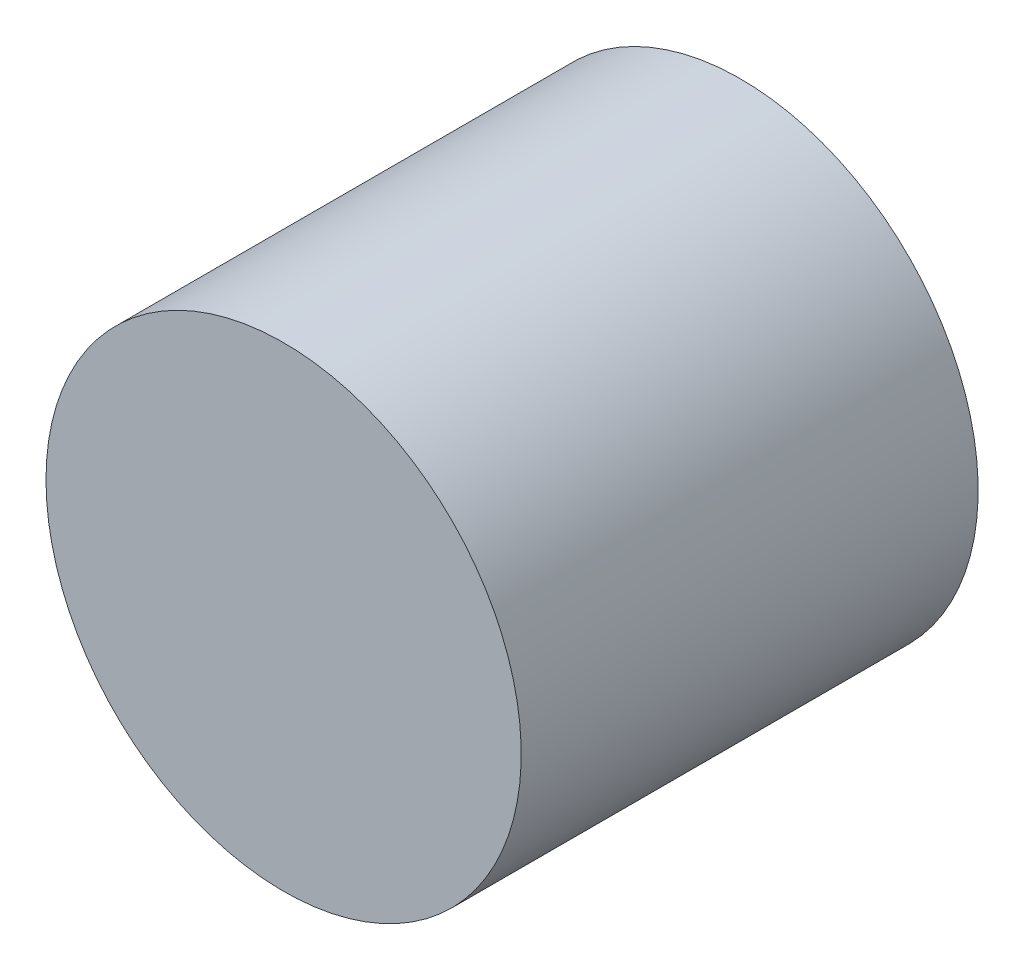
ISO-10303-21;
HEADER;
FILE_DESCRIPTION(('STEP AP214'),'2;1');
FILE_NAME('part.step','',(''),(''),'','','');
FILE_SCHEMA(('AUTOMOTIVE_DESIGN { 1 0 10303 214 1 1 1 1 }'));
ENDSEC;
DATA;
#1=APPLICATION_CONTEXT('core data for automotive mechanical design processes');
#2=APPLICATION_PROTOCOL_DEFINITION('international standard','automotive_design',2000,#1);
#3=PRODUCT_CONTEXT('',#1,'mechanical');
#4=PRODUCT('Part','Part','',(#3));
#5=PRODUCT_RELATED_PRODUCT_CATEGORY('part','',(#4));
#6=PRODUCT_DEFINITION_FORMATION('','',#4);
#7=PRODUCT_DEFINITION_CONTEXT('part definition',#1,'design');
#8=PRODUCT_DEFINITION('design','',#6,#7);
#9=PRODUCT_DEFINITION_SHAPE('','',#8);
#10=(LENGTH_UNIT() NAMED_UNIT(*) SI_UNIT(.MILLI.,.METRE.));
#11=(NAMED_UNIT(*) PLANE_ANGLE_UNIT() SI_UNIT($,.RADIAN.));
#12=(NAMED_UNIT(*) SI_UNIT($,.STERADIAN.) SOLID_ANGLE_UNIT());
#13=UNCERTAINTY_MEASURE_WITH_UNIT(LENGTH_MEASURE(1.E-05),#10,'distance_accuracy_value','');
#14=(GEOMETRIC_REPRESENTATION_CONTEXT(3) GLOBAL_UNCERTAINTY_ASSIGNED_CONTEXT((#13)) GLOBAL_UNIT_ASSIGNED_CONTEXT((#10,
#11,#12)) REPRESENTATION_CONTEXT('',''));
#15=CARTESIAN_POINT('',(0.,0.,0.));
#16=DIRECTION('',(0.,0.,1.));
#17=DIRECTION('',(1.,0.,0.));
#18=AXIS2_PLACEMENT_3D('',#15,#16,#17);
#19=CARTESIAN_POINT('',(5.19999976,0.,0.));
#20=DIRECTION('',(0.,0.,-1.));
#21=DIRECTION('',(-1.,0.,0.));
#22=AXIS2_PLACEMENT_3D('',#19,#20,#21);
#23=PLANE('',#22);
#24=CARTESIAN_POINT('',(0.,0.,0.));
#25=DIRECTION('',(0.,0.,-1.));
#26=DIRECTION('',(-1.,0.,0.));
#27=AXIS2_PLACEMENT_3D('',#24,#25,#26);
#28=CIRCLE('',#27,5.19999976);
#29=CARTESIAN_POINT('',(-5.19999976,0.,0.));
#30=VERTEX_POINT('',#29);
#31=EDGE_CURVE('E18',#30,#30,#28,.F.);
#32=ORIENTED_EDGE('',*,*,#31,.F.);
#33=EDGE_LOOP('',(#32));
#34=FACE_BOUND('',#33,.T.);
#35=ADVANCED_FACE('F15',(#34),#23,.T.);
#36=CARTESIAN_POINT('',(5.19999976,0.,10.00000032));
#37=DIRECTION('',(0.,0.,-1.));
#38=DIRECTION('',(-1.,0.,0.));
#39=AXIS2_PLACEMENT_3D('',#36,#37,#38);
#40=PLANE('',#39);
#41=CARTESIAN_POINT('',(0.,0.,10.00000032));
#42=DIRECTION('',(0.,0.,-1.));
#43=DIRECTION('',(-1.,0.,0.));
#44=AXIS2_PLACEMENT_3D('',#41,#42,#43);
#45=CIRCLE('',#44,5.19999976);
#46=CARTESIAN_POINT('',(-5.19999976,0.,10.00000032));
#47=VERTEX_POINT('',#46);
#48=EDGE_CURVE('E10',#47,#47,#45,.T.);
#49=ORIENTED_EDGE('',*,*,#48,.F.);
#50=EDGE_LOOP('',(#49));
#51=FACE_BOUND('',#50,.T.);
#52=ADVANCED_FACE('F30',(#51),#40,.F.);
#53=CARTESIAN_POINT('',(0.,0.,0.));
#54=DIRECTION('',(0.,0.,-1.));
#55=DIRECTION('',(-1.,0.,0.));
#56=AXIS2_PLACEMENT_3D('',#53,#54,#55);
#57=CYLINDRICAL_SURFACE('',#56,5.19999976);
#58=ORIENTED_EDGE('',*,*,#48,.T.);
#59=EDGE_LOOP('',(#58));
#60=FACE_BOUND('',#59,.T.);
#61=ORIENTED_EDGE('',*,*,#31,.T.);
#62=EDGE_LOOP('',(#61));
#63=FACE_BOUND('',#62,.T.);
#64=ADVANCED_FACE('F27',(#60,#63),#57,.T.);
#65=CLOSED_SHELL('',(#35,#52,#64));
#66=MANIFOLD_SOLID_BREP('B1',#65);
#67=ADVANCED_BREP_SHAPE_REPRESENTATION('',(#18,#66),#14);
#68=SHAPE_DEFINITION_REPRESENTATION(#9,#67);
ENDSEC;
END-ISO-10303-21;
